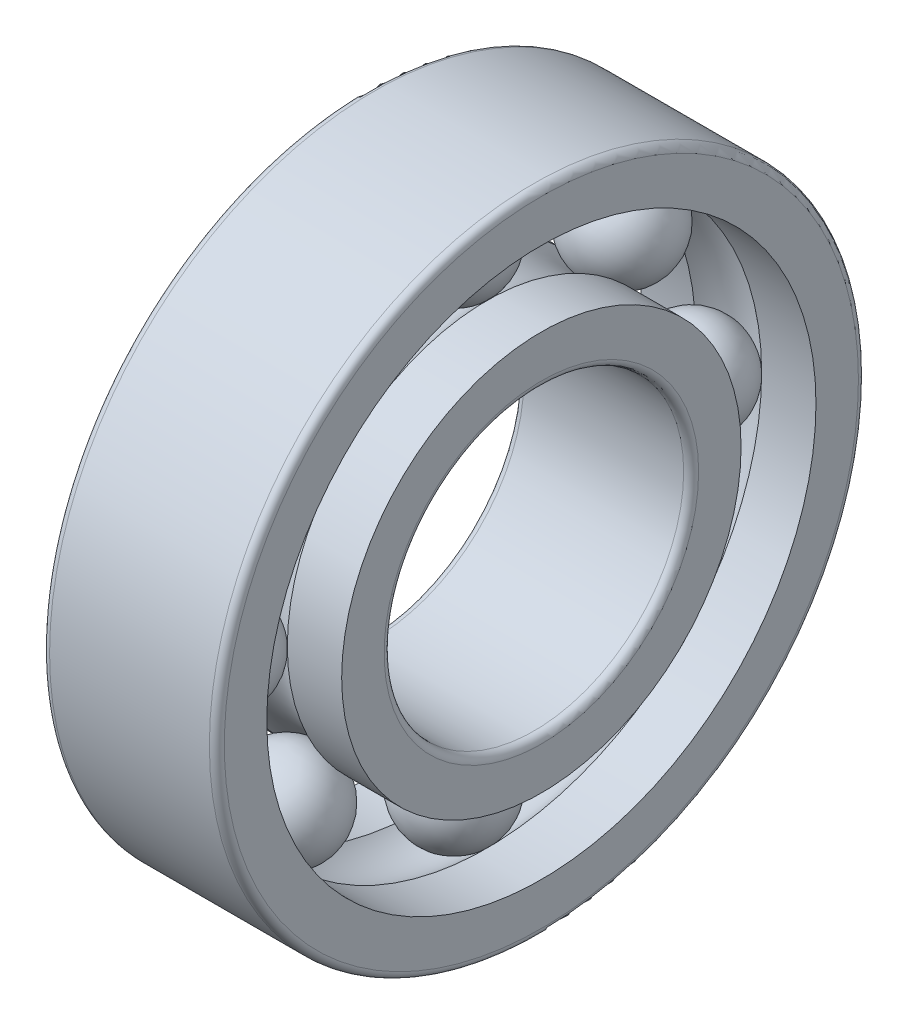
ISO-10303-21;
HEADER;
FILE_DESCRIPTION(('STEP AP214'),'2;1');
FILE_NAME('part.step','',(''),(''),'','','');
FILE_SCHEMA(('AUTOMOTIVE_DESIGN { 1 0 10303 214 1 1 1 1 }'));
ENDSEC;
DATA;
#1=APPLICATION_CONTEXT('core data for automotive mechanical design processes');
#2=APPLICATION_PROTOCOL_DEFINITION('international standard','automotive_design',2000,#1);
#3=PRODUCT_CONTEXT('',#1,'mechanical');
#4=PRODUCT('Part','Part','',(#3));
#5=PRODUCT_RELATED_PRODUCT_CATEGORY('part','',(#4));
#6=PRODUCT_DEFINITION_FORMATION('','',#4);
#7=PRODUCT_DEFINITION_CONTEXT('part definition',#1,'design');
#8=PRODUCT_DEFINITION('design','',#6,#7);
#9=PRODUCT_DEFINITION_SHAPE('','',#8);
#10=(LENGTH_UNIT() NAMED_UNIT(*) SI_UNIT(.MILLI.,.METRE.));
#11=(NAMED_UNIT(*) PLANE_ANGLE_UNIT() SI_UNIT($,.RADIAN.));
#12=(NAMED_UNIT(*) SI_UNIT($,.STERADIAN.) SOLID_ANGLE_UNIT());
#13=UNCERTAINTY_MEASURE_WITH_UNIT(LENGTH_MEASURE(1.E-05),#10,'distance_accuracy_value','');
#14=(GEOMETRIC_REPRESENTATION_CONTEXT(3) GLOBAL_UNCERTAINTY_ASSIGNED_CONTEXT((#13)) GLOBAL_UNIT_ASSIGNED_CONTEXT((#10,
#11,#12)) REPRESENTATION_CONTEXT('',''));
#15=CARTESIAN_POINT('',(0.,0.,0.));
#16=DIRECTION('',(0.,0.,1.));
#17=DIRECTION('',(1.,0.,0.));
#18=AXIS2_PLACEMENT_3D('',#15,#16,#17);
#19=CARTESIAN_POINT('',(1.75,0.,0.));
#20=DIRECTION('',(1.,0.,0.));
#21=DIRECTION('',(0.,0.,-1.));
#22=AXIS2_PLACEMENT_3D('',#19,#20,#21);
#23=TOROIDAL_SURFACE('',#22,4.75000000000013,0.999999999999873);
#24=CARTESIAN_POINT('',(2.41143782776609,0.,0.));
#25=DIRECTION('',(-1.,0.,0.));
#26=DIRECTION('',(0.,0.,1.));
#27=AXIS2_PLACEMENT_3D('',#24,#25,#26);
#28=CIRCLE('',#27,5.5);
#29=CARTESIAN_POINT('',(2.41143782776609,0.,5.5));
#30=VERTEX_POINT('',#29);
#31=EDGE_CURVE('P0_E108',#30,#30,#28,.F.);
#32=ORIENTED_EDGE('',*,*,#31,.T.);
#33=EDGE_LOOP('',(#32));
#34=FACE_BOUND('',#33,.T.);
#35=CARTESIAN_POINT('',(1.08856217223391,0.,0.));
#36=DIRECTION('',(-1.,0.,0.));
#37=DIRECTION('',(0.,0.,1.));
#38=AXIS2_PLACEMENT_3D('',#35,#36,#37);
#39=CIRCLE('',#38,5.5);
#40=CARTESIAN_POINT('',(1.08856217223391,0.,5.5));
#41=VERTEX_POINT('',#40);
#42=EDGE_CURVE('P0_E113',#41,#41,#39,.T.);
#43=ORIENTED_EDGE('',*,*,#42,.T.);
#44=EDGE_LOOP('',(#43));
#45=FACE_BOUND('',#44,.T.);
#46=ADVANCED_FACE('P0_F14',(#34,#45),#23,.F.);
#47=CARTESIAN_POINT('',(200.,0.,0.));
#48=DIRECTION('',(-1.,0.,0.));
#49=DIRECTION('',(0.,0.,1.));
#50=AXIS2_PLACEMENT_3D('',#47,#48,#49);
#51=CYLINDRICAL_SURFACE('',#50,5.5);
#52=CARTESIAN_POINT('',(0.,0.,0.));
#53=DIRECTION('',(-1.,0.,0.));
#54=DIRECTION('',(0.,0.,1.));
#55=AXIS2_PLACEMENT_3D('',#52,#53,#54);
#56=CIRCLE('',#55,5.5);
#57=CARTESIAN_POINT('',(0.,0.,5.5));
#58=VERTEX_POINT('',#57);
#59=EDGE_CURVE('P0_E18',#58,#58,#56,.F.);
#60=ORIENTED_EDGE('',*,*,#59,.F.);
#61=EDGE_LOOP('',(#60));
#62=FACE_BOUND('',#61,.T.);
#63=ORIENTED_EDGE('',*,*,#42,.F.);
#64=EDGE_LOOP('',(#63));
#65=FACE_BOUND('',#64,.T.);
#66=ADVANCED_FACE('P0_F84',(#62,#65),#51,.F.);
#67=CARTESIAN_POINT('',(200.,0.,0.));
#68=DIRECTION('',(-1.,0.,0.));
#69=DIRECTION('',(0.,0.,1.));
#70=AXIS2_PLACEMENT_3D('',#67,#68,#69);
#71=CYLINDRICAL_SURFACE('',#70,5.5);
#72=ORIENTED_EDGE('',*,*,#31,.F.);
#73=EDGE_LOOP('',(#72));
#74=FACE_BOUND('',#73,.T.);
#75=CARTESIAN_POINT('',(3.5,0.,0.));
#76=DIRECTION('',(-1.,0.,0.));
#77=DIRECTION('',(0.,0.,1.));
#78=AXIS2_PLACEMENT_3D('',#75,#76,#77);
#79=CIRCLE('',#78,5.5);
#80=CARTESIAN_POINT('',(3.5,0.,5.5));
#81=VERTEX_POINT('',#80);
#82=EDGE_CURVE('P0_E103',#81,#81,#79,.T.);
#83=ORIENTED_EDGE('',*,*,#82,.F.);
#84=EDGE_LOOP('',(#83));
#85=FACE_BOUND('',#84,.T.);
#86=ADVANCED_FACE('P0_F81',(#74,#85),#71,.F.);
#87=CARTESIAN_POINT('',(0.,6.35,0.));
#88=DIRECTION('',(-1.,0.,0.));
#89=DIRECTION('',(0.,0.,1.));
#90=AXIS2_PLACEMENT_3D('',#87,#88,#89);
#91=PLANE('',#90);
#92=CARTESIAN_POINT('',(0.,0.,0.));
#93=DIRECTION('',(1.,0.,0.));
#94=DIRECTION('',(0.,0.,-1.));
#95=AXIS2_PLACEMENT_3D('',#92,#93,#94);
#96=CIRCLE('',#95,6.35);
#97=CARTESIAN_POINT('',(0.,0.,-6.35));
#98=VERTEX_POINT('',#97);
#99=EDGE_CURVE('P0_E65',#98,#98,#96,.T.);
#100=ORIENTED_EDGE('',*,*,#99,.F.);
#101=EDGE_LOOP('',(#100));
#102=FACE_BOUND('',#101,.T.);
#103=ORIENTED_EDGE('',*,*,#59,.T.);
#104=EDGE_LOOP('',(#103));
#105=FACE_BOUND('',#104,.T.);
#106=ADVANCED_FACE('P0_F71',(#102,#105),#91,.T.);
#107=CARTESIAN_POINT('',(3.5,5.5,0.));
#108=DIRECTION('',(1.,0.,0.));
#109=DIRECTION('',(0.,0.,-1.));
#110=AXIS2_PLACEMENT_3D('',#107,#108,#109);
#111=PLANE('',#110);
#112=ORIENTED_EDGE('',*,*,#82,.T.);
#113=EDGE_LOOP('',(#112));
#114=FACE_BOUND('',#113,.T.);
#115=CARTESIAN_POINT('',(3.5,0.,0.));
#116=DIRECTION('',(-1.,0.,0.));
#117=DIRECTION('',(0.,0.,-1.));
#118=AXIS2_PLACEMENT_3D('',#115,#116,#117);
#119=CIRCLE('',#118,6.35);
#120=CARTESIAN_POINT('',(3.5,0.,-6.35));
#121=VERTEX_POINT('',#120);
#122=EDGE_CURVE('P0_E27',#121,#121,#119,.T.);
#123=ORIENTED_EDGE('',*,*,#122,.F.);
#124=EDGE_LOOP('',(#123));
#125=FACE_BOUND('',#124,.T.);
#126=ADVANCED_FACE('P0_F80',(#114,#125),#111,.T.);
#127=CARTESIAN_POINT('',(0.14999999999997,0.,0.));
#128=DIRECTION('',(1.,0.,0.));
#129=DIRECTION('',(0.,0.,-1.));
#130=AXIS2_PLACEMENT_3D('',#127,#128,#129);
#131=TOROIDAL_SURFACE('',#130,6.35000000000003,0.14999999999997);
#132=CARTESIAN_POINT('',(0.150000000000011,0.,0.));
#133=DIRECTION('',(-1.,0.,0.));
#134=DIRECTION('',(0.,0.,1.));
#135=AXIS2_PLACEMENT_3D('',#132,#133,#134);
#136=CIRCLE('',#135,6.5);
#137=CARTESIAN_POINT('',(0.150000000000011,0.,6.5));
#138=VERTEX_POINT('',#137);
#139=EDGE_CURVE('P0_E22',#138,#138,#136,.F.);
#140=ORIENTED_EDGE('',*,*,#139,.F.);
#141=EDGE_LOOP('',(#140));
#142=FACE_BOUND('',#141,.T.);
#143=ORIENTED_EDGE('',*,*,#99,.T.);
#144=EDGE_LOOP('',(#143));
#145=FACE_BOUND('',#144,.T.);
#146=ADVANCED_FACE('P0_F45',(#142,#145),#131,.T.);
#147=CARTESIAN_POINT('',(3.35000000000006,0.,0.));
#148=DIRECTION('',(1.,0.,0.));
#149=DIRECTION('',(0.,0.,-1.));
#150=AXIS2_PLACEMENT_3D('',#147,#148,#149);
#151=TOROIDAL_SURFACE('',#150,6.35000000000006,0.14999999999994);
#152=ORIENTED_EDGE('',*,*,#122,.T.);
#153=EDGE_LOOP('',(#152));
#154=FACE_BOUND('',#153,.T.);
#155=CARTESIAN_POINT('',(3.35000000000005,0.,0.));
#156=DIRECTION('',(-1.,0.,0.));
#157=DIRECTION('',(0.,0.,1.));
#158=AXIS2_PLACEMENT_3D('',#155,#156,#157);
#159=CIRCLE('',#158,6.5);
#160=CARTESIAN_POINT('',(3.35000000000005,0.,6.5));
#161=VERTEX_POINT('',#160);
#162=EDGE_CURVE('P0_E10',#161,#161,#159,.T.);
#163=ORIENTED_EDGE('',*,*,#162,.F.);
#164=EDGE_LOOP('',(#163));
#165=FACE_BOUND('',#164,.T.);
#166=ADVANCED_FACE('P0_F39',(#154,#165),#151,.T.);
#167=CARTESIAN_POINT('',(200.,0.,0.));
#168=DIRECTION('',(-1.,0.,0.));
#169=DIRECTION('',(0.,0.,1.));
#170=AXIS2_PLACEMENT_3D('',#167,#168,#169);
#171=CYLINDRICAL_SURFACE('',#170,6.5);
#172=ORIENTED_EDGE('',*,*,#162,.T.);
#173=EDGE_LOOP('',(#172));
#174=FACE_BOUND('',#173,.T.);
#175=ORIENTED_EDGE('',*,*,#139,.T.);
#176=EDGE_LOOP('',(#175));
#177=FACE_BOUND('',#176,.T.);
#178=ADVANCED_FACE('P0_F44',(#174,#177),#171,.T.);
#179=CLOSED_SHELL('',(#46,#66,#86,#106,#126,#146,#166,#178));
#180=MANIFOLD_SOLID_BREP('P0_B1',#179);
#181=CARTESIAN_POINT('',(1.75,0.,0.));
#182=DIRECTION('',(1.,0.,0.));
#183=DIRECTION('',(0.,0.,-1.));
#184=AXIS2_PLACEMENT_3D('',#181,#182,#183);
#185=TOROIDAL_SURFACE('',#184,4.74999999999987,0.999999999999873);
#186=CARTESIAN_POINT('',(1.0885621722339,0.,0.));
#187=DIRECTION('',(-1.,0.,0.));
#188=DIRECTION('',(0.,0.,1.));
#189=AXIS2_PLACEMENT_3D('',#186,#187,#188);
#190=CIRCLE('',#189,4.);
#191=CARTESIAN_POINT('',(1.0885621722339,0.,4.));
#192=VERTEX_POINT('',#191);
#193=EDGE_CURVE('P1_E109',#192,#192,#190,.T.);
#194=ORIENTED_EDGE('',*,*,#193,.F.);
#195=EDGE_LOOP('',(#194));
#196=FACE_BOUND('',#195,.T.);
#197=CARTESIAN_POINT('',(2.4114378277661,0.,0.));
#198=DIRECTION('',(-1.,0.,0.));
#199=DIRECTION('',(0.,0.,1.));
#200=AXIS2_PLACEMENT_3D('',#197,#198,#199);
#201=CIRCLE('',#200,4.);
#202=CARTESIAN_POINT('',(2.4114378277661,0.,4.));
#203=VERTEX_POINT('',#202);
#204=EDGE_CURVE('P1_E114',#203,#203,#201,.F.);
#205=ORIENTED_EDGE('',*,*,#204,.F.);
#206=EDGE_LOOP('',(#205));
#207=FACE_BOUND('',#206,.T.);
#208=ADVANCED_FACE('P1_F14',(#196,#207),#185,.F.);
#209=CARTESIAN_POINT('',(50.,0.,0.));
#210=DIRECTION('',(-1.,0.,0.));
#211=DIRECTION('',(0.,0.,1.));
#212=AXIS2_PLACEMENT_3D('',#209,#210,#211);
#213=CYLINDRICAL_SURFACE('',#212,4.);
#214=CARTESIAN_POINT('',(3.5,0.,0.));
#215=DIRECTION('',(-1.,0.,0.));
#216=DIRECTION('',(0.,0.,1.));
#217=AXIS2_PLACEMENT_3D('',#214,#215,#216);
#218=CIRCLE('',#217,4.);
#219=CARTESIAN_POINT('',(3.5,0.,4.));
#220=VERTEX_POINT('',#219);
#221=EDGE_CURVE('P1_E18',#220,#220,#218,.F.);
#222=ORIENTED_EDGE('',*,*,#221,.F.);
#223=EDGE_LOOP('',(#222));
#224=FACE_BOUND('',#223,.T.);
#225=ORIENTED_EDGE('',*,*,#204,.T.);
#226=EDGE_LOOP('',(#225));
#227=FACE_BOUND('',#226,.T.);
#228=ADVANCED_FACE('P1_F84',(#224,#227),#213,.T.);
#229=CARTESIAN_POINT('',(50.,0.,0.));
#230=DIRECTION('',(-1.,0.,0.));
#231=DIRECTION('',(0.,0.,1.));
#232=AXIS2_PLACEMENT_3D('',#229,#230,#231);
#233=CYLINDRICAL_SURFACE('',#232,4.);
#234=ORIENTED_EDGE('',*,*,#193,.T.);
#235=EDGE_LOOP('',(#234));
#236=FACE_BOUND('',#235,.T.);
#237=CARTESIAN_POINT('',(0.,0.,0.));
#238=DIRECTION('',(-1.,0.,0.));
#239=DIRECTION('',(0.,0.,1.));
#240=AXIS2_PLACEMENT_3D('',#237,#238,#239);
#241=CIRCLE('',#240,4.);
#242=CARTESIAN_POINT('',(0.,0.,4.));
#243=VERTEX_POINT('',#242);
#244=EDGE_CURVE('P1_E104',#243,#243,#241,.T.);
#245=ORIENTED_EDGE('',*,*,#244,.F.);
#246=EDGE_LOOP('',(#245));
#247=FACE_BOUND('',#246,.T.);
#248=ADVANCED_FACE('P1_F81',(#236,#247),#233,.T.);
#249=CARTESIAN_POINT('',(3.5,3.15,0.));
#250=DIRECTION('',(1.,0.,0.));
#251=DIRECTION('',(0.,0.,-1.));
#252=AXIS2_PLACEMENT_3D('',#249,#250,#251);
#253=PLANE('',#252);
#254=CARTESIAN_POINT('',(3.5,0.,0.));
#255=DIRECTION('',(1.,0.,0.));
#256=DIRECTION('',(0.,0.,-1.));
#257=AXIS2_PLACEMENT_3D('',#254,#255,#256);
#258=CIRCLE('',#257,3.14999999999994);
#259=CARTESIAN_POINT('',(3.5,0.,-3.14999999999994));
#260=VERTEX_POINT('',#259);
#261=EDGE_CURVE('P1_E65',#260,#260,#258,.T.);
#262=ORIENTED_EDGE('',*,*,#261,.F.);
#263=EDGE_LOOP('',(#262));
#264=FACE_BOUND('',#263,.T.);
#265=ORIENTED_EDGE('',*,*,#221,.T.);
#266=EDGE_LOOP('',(#265));
#267=FACE_BOUND('',#266,.T.);
#268=ADVANCED_FACE('P1_F71',(#264,#267),#253,.T.);
#269=CARTESIAN_POINT('',(0.,4.,0.));
#270=DIRECTION('',(-1.,0.,0.));
#271=DIRECTION('',(0.,0.,1.));
#272=AXIS2_PLACEMENT_3D('',#269,#270,#271);
#273=PLANE('',#272);
#274=ORIENTED_EDGE('',*,*,#244,.T.);
#275=EDGE_LOOP('',(#274));
#276=FACE_BOUND('',#275,.T.);
#277=CARTESIAN_POINT('',(0.,0.,0.));
#278=DIRECTION('',(-1.,0.,0.));
#279=DIRECTION('',(0.,0.,-1.));
#280=AXIS2_PLACEMENT_3D('',#277,#278,#279);
#281=CIRCLE('',#280,3.15000000223514);
#282=CARTESIAN_POINT('',(0.,0.,-3.15000000223514));
#283=VERTEX_POINT('',#282);
#284=EDGE_CURVE('P1_E27',#283,#283,#281,.T.);
#285=ORIENTED_EDGE('',*,*,#284,.F.);
#286=EDGE_LOOP('',(#285));
#287=FACE_BOUND('',#286,.T.);
#288=ADVANCED_FACE('P1_F80',(#276,#287),#273,.T.);
#289=CARTESIAN_POINT('',(3.35000000000006,0.,0.));
#290=DIRECTION('',(1.,0.,0.));
#291=DIRECTION('',(0.,0.,-1.));
#292=AXIS2_PLACEMENT_3D('',#289,#290,#291);
#293=TOROIDAL_SURFACE('',#292,3.14999999999994,0.149999999999938);
#294=CARTESIAN_POINT('',(3.35,0.,0.));
#295=DIRECTION('',(-1.,0.,0.));
#296=DIRECTION('',(0.,0.,1.));
#297=AXIS2_PLACEMENT_3D('',#294,#295,#296);
#298=CIRCLE('',#297,3.);
#299=CARTESIAN_POINT('',(3.35,0.,3.));
#300=VERTEX_POINT('',#299);
#301=EDGE_CURVE('P1_E22',#300,#300,#298,.T.);
#302=ORIENTED_EDGE('',*,*,#301,.T.);
#303=EDGE_LOOP('',(#302));
#304=FACE_BOUND('',#303,.T.);
#305=ORIENTED_EDGE('',*,*,#261,.T.);
#306=EDGE_LOOP('',(#305));
#307=FACE_BOUND('',#306,.T.);
#308=ADVANCED_FACE('P1_F45',(#304,#307),#293,.T.);
#309=CARTESIAN_POINT('',(0.149999999999969,0.,0.));
#310=DIRECTION('',(1.,0.,0.));
#311=DIRECTION('',(0.,0.,-1.));
#312=AXIS2_PLACEMENT_3D('',#309,#310,#311);
#313=TOROIDAL_SURFACE('',#312,3.14999999999997,0.149999999999969);
#314=ORIENTED_EDGE('',*,*,#284,.T.);
#315=EDGE_LOOP('',(#314));
#316=FACE_BOUND('',#315,.T.);
#317=CARTESIAN_POINT('',(0.14999999999997,0.,0.));
#318=DIRECTION('',(-1.,0.,0.));
#319=DIRECTION('',(0.,0.,1.));
#320=AXIS2_PLACEMENT_3D('',#317,#318,#319);
#321=CIRCLE('',#320,3.);
#322=CARTESIAN_POINT('',(0.14999999999997,0.,3.));
#323=VERTEX_POINT('',#322);
#324=EDGE_CURVE('P1_E10',#323,#323,#321,.F.);
#325=ORIENTED_EDGE('',*,*,#324,.T.);
#326=EDGE_LOOP('',(#325));
#327=FACE_BOUND('',#326,.T.);
#328=ADVANCED_FACE('P1_F39',(#316,#327),#313,.T.);
#329=CARTESIAN_POINT('',(50.,0.,0.));
#330=DIRECTION('',(-1.,0.,0.));
#331=DIRECTION('',(0.,0.,1.));
#332=AXIS2_PLACEMENT_3D('',#329,#330,#331);
#333=CYLINDRICAL_SURFACE('',#332,3.);
#334=ORIENTED_EDGE('',*,*,#324,.F.);
#335=EDGE_LOOP('',(#334));
#336=FACE_BOUND('',#335,.T.);
#337=ORIENTED_EDGE('',*,*,#301,.F.);
#338=EDGE_LOOP('',(#337));
#339=FACE_BOUND('',#338,.T.);
#340=ADVANCED_FACE('P1_F44',(#336,#339),#333,.F.);
#341=CLOSED_SHELL('',(#208,#228,#248,#268,#288,#308,#328,#340));
#342=MANIFOLD_SOLID_BREP('P1_B1',#341);
#343=CARTESIAN_POINT('',(1.75,3.3587572106361,3.3587572106361));
#344=DIRECTION('',(0.,-0.707106781186548,-0.707106781186548));
#345=DIRECTION('',(0.,0.707106781186548,-0.707106781186548));
#346=AXIS2_PLACEMENT_3D('',#343,#344,#345);
#347=SPHERICAL_SURFACE('',#346,1.);
#348=CARTESIAN_POINT('',(1.75,4.06586399182265,4.06586399182265));
#349=VERTEX_POINT('',#348);
#350=VERTEX_LOOP('',#349);
#351=FACE_BOUND('',#350,.T.);
#352=CARTESIAN_POINT('',(1.75,2.65165042944955,2.65165042944955));
#353=VERTEX_POINT('',#352);
#354=VERTEX_LOOP('',#353);
#355=FACE_BOUND('',#354,.T.);
#356=ADVANCED_FACE('P2_F15',(#351,#355),#347,.T.);
#357=CLOSED_SHELL('',(#356));
#358=MANIFOLD_SOLID_BREP('P2_B1',#357);
#359=CARTESIAN_POINT('',(1.75,0.,4.75));
#360=DIRECTION('',(0.,0.,-1.));
#361=DIRECTION('',(0.,1.,0.));
#362=AXIS2_PLACEMENT_3D('',#359,#360,#361);
#363=SPHERICAL_SURFACE('',#362,1.);
#364=CARTESIAN_POINT('',(1.75,0.,5.75));
#365=VERTEX_POINT('',#364);
#366=VERTEX_LOOP('',#365);
#367=FACE_BOUND('',#366,.T.);
#368=CARTESIAN_POINT('',(1.75,0.,3.75));
#369=VERTEX_POINT('',#368);
#370=VERTEX_LOOP('',#369);
#371=FACE_BOUND('',#370,.T.);
#372=ADVANCED_FACE('P3_F15',(#367,#371),#363,.T.);
#373=CLOSED_SHELL('',(#372));
#374=MANIFOLD_SOLID_BREP('P3_B1',#373);
#375=CARTESIAN_POINT('',(1.75,-3.3587572106361,3.3587572106361));
#376=DIRECTION('',(0.,0.707106781186548,-0.707106781186548));
#377=DIRECTION('',(0.,0.707106781186548,0.707106781186548));
#378=AXIS2_PLACEMENT_3D('',#375,#376,#377);
#379=SPHERICAL_SURFACE('',#378,1.);
#380=CARTESIAN_POINT('',(1.75,-4.06586399182265,4.06586399182265));
#381=VERTEX_POINT('',#380);
#382=VERTEX_LOOP('',#381);
#383=FACE_BOUND('',#382,.T.);
#384=CARTESIAN_POINT('',(1.75,-2.65165042944955,2.65165042944955));
#385=VERTEX_POINT('',#384);
#386=VERTEX_LOOP('',#385);
#387=FACE_BOUND('',#386,.T.);
#388=ADVANCED_FACE('P4_F15',(#383,#387),#379,.T.);
#389=CLOSED_SHELL('',(#388));
#390=MANIFOLD_SOLID_BREP('P4_B1',#389);
#391=CARTESIAN_POINT('',(1.75,-4.75,0.));
#392=DIRECTION('',(0.,1.,0.));
#393=DIRECTION('',(0.,0.,1.));
#394=AXIS2_PLACEMENT_3D('',#391,#392,#393);
#395=SPHERICAL_SURFACE('',#394,1.);
#396=CARTESIAN_POINT('',(1.75,-5.75,0.));
#397=VERTEX_POINT('',#396);
#398=VERTEX_LOOP('',#397);
#399=FACE_BOUND('',#398,.T.);
#400=CARTESIAN_POINT('',(1.75,-3.75,0.));
#401=VERTEX_POINT('',#400);
#402=VERTEX_LOOP('',#401);
#403=FACE_BOUND('',#402,.T.);
#404=ADVANCED_FACE('P5_F15',(#399,#403),#395,.T.);
#405=CLOSED_SHELL('',(#404));
#406=MANIFOLD_SOLID_BREP('P5_B1',#405);
#407=CARTESIAN_POINT('',(1.75,-3.3587572106361,-3.3587572106361));
#408=DIRECTION('',(0.,0.707106781186548,0.707106781186548));
#409=DIRECTION('',(0.,-0.707106781186548,0.707106781186548));
#410=AXIS2_PLACEMENT_3D('',#407,#408,#409);
#411=SPHERICAL_SURFACE('',#410,1.);
#412=CARTESIAN_POINT('',(1.75,-4.06586399182265,-4.06586399182265));
#413=VERTEX_POINT('',#412);
#414=VERTEX_LOOP('',#413);
#415=FACE_BOUND('',#414,.T.);
#416=CARTESIAN_POINT('',(1.75,-2.65165042944955,-2.65165042944955));
#417=VERTEX_POINT('',#416);
#418=VERTEX_LOOP('',#417);
#419=FACE_BOUND('',#418,.T.);
#420=ADVANCED_FACE('P6_F15',(#415,#419),#411,.T.);
#421=CLOSED_SHELL('',(#420));
#422=MANIFOLD_SOLID_BREP('P6_B1',#421);
#423=CARTESIAN_POINT('',(1.75,0.,-4.75));
#424=DIRECTION('',(0.,0.,1.));
#425=DIRECTION('',(0.,-1.,0.));
#426=AXIS2_PLACEMENT_3D('',#423,#424,#425);
#427=SPHERICAL_SURFACE('',#426,1.);
#428=CARTESIAN_POINT('',(1.75,0.,-5.75));
#429=VERTEX_POINT('',#428);
#430=VERTEX_LOOP('',#429);
#431=FACE_BOUND('',#430,.T.);
#432=CARTESIAN_POINT('',(1.75,0.,-3.75));
#433=VERTEX_POINT('',#432);
#434=VERTEX_LOOP('',#433);
#435=FACE_BOUND('',#434,.T.);
#436=ADVANCED_FACE('P7_F15',(#431,#435),#427,.T.);
#437=CLOSED_SHELL('',(#436));
#438=MANIFOLD_SOLID_BREP('P7_B1',#437);
#439=CARTESIAN_POINT('',(1.75,3.3587572106361,-3.3587572106361));
#440=DIRECTION('',(0.,-0.707106781186548,0.707106781186548));
#441=DIRECTION('',(0.,-0.707106781186548,-0.707106781186548));
#442=AXIS2_PLACEMENT_3D('',#439,#440,#441);
#443=SPHERICAL_SURFACE('',#442,1.);
#444=CARTESIAN_POINT('',(1.75,4.06586399182265,-4.06586399182265));
#445=VERTEX_POINT('',#444);
#446=VERTEX_LOOP('',#445);
#447=FACE_BOUND('',#446,.T.);
#448=CARTESIAN_POINT('',(1.75,2.65165042944955,-2.65165042944955));
#449=VERTEX_POINT('',#448);
#450=VERTEX_LOOP('',#449);
#451=FACE_BOUND('',#450,.T.);
#452=ADVANCED_FACE('P8_F15',(#447,#451),#443,.T.);
#453=CLOSED_SHELL('',(#452));
#454=MANIFOLD_SOLID_BREP('P8_B1',#453);
#455=CARTESIAN_POINT('',(1.75,4.75,0.));
#456=DIRECTION('',(0.,-1.,0.));
#457=DIRECTION('',(0.,0.,-1.));
#458=AXIS2_PLACEMENT_3D('',#455,#456,#457);
#459=SPHERICAL_SURFACE('',#458,1.);
#460=CARTESIAN_POINT('',(1.75,5.75,0.));
#461=VERTEX_POINT('',#460);
#462=VERTEX_LOOP('',#461);
#463=FACE_BOUND('',#462,.T.);
#464=CARTESIAN_POINT('',(1.75,3.75,0.));
#465=VERTEX_POINT('',#464);
#466=VERTEX_LOOP('',#465);
#467=FACE_BOUND('',#466,.T.);
#468=ADVANCED_FACE('P9_F15',(#463,#467),#459,.T.);
#469=CLOSED_SHELL('',(#468));
#470=MANIFOLD_SOLID_BREP('P9_B1',#469);
#471=ADVANCED_BREP_SHAPE_REPRESENTATION('',(#18,#180,#342,#358,#374,#390,#406,#422,#438,#454,
#470),#14);
#472=SHAPE_DEFINITION_REPRESENTATION(#9,#471);
ENDSEC;
END-ISO-10303-21;
